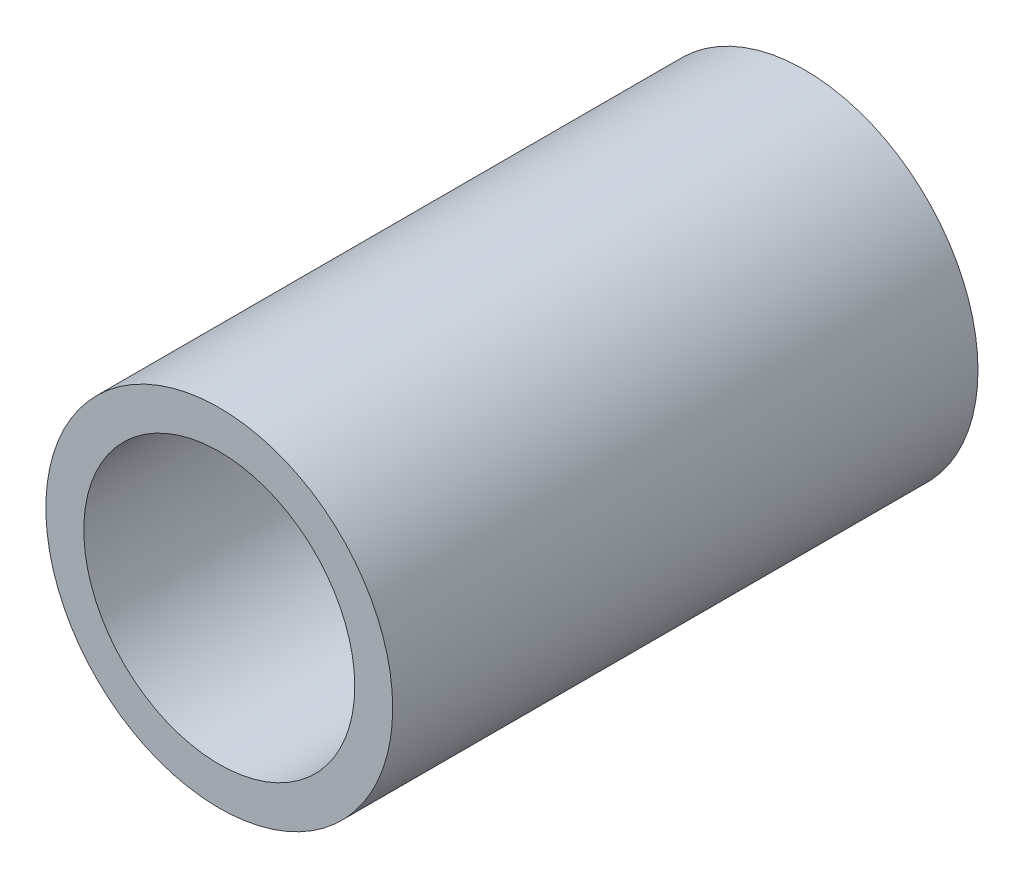
ISO-10303-21;
HEADER;
FILE_DESCRIPTION(('STEP AP214'),'2;1');
FILE_NAME('part.step','',(''),(''),'','','');
FILE_SCHEMA(('AUTOMOTIVE_DESIGN { 1 0 10303 214 1 1 1 1 }'));
ENDSEC;
DATA;
#1=APPLICATION_CONTEXT('core data for automotive mechanical design processes');
#2=APPLICATION_PROTOCOL_DEFINITION('international standard','automotive_design',2000,#1);
#3=PRODUCT_CONTEXT('',#1,'mechanical');
#4=PRODUCT('Part','Part','',(#3));
#5=PRODUCT_RELATED_PRODUCT_CATEGORY('part','',(#4));
#6=PRODUCT_DEFINITION_FORMATION('','',#4);
#7=PRODUCT_DEFINITION_CONTEXT('part definition',#1,'design');
#8=PRODUCT_DEFINITION('design','',#6,#7);
#9=PRODUCT_DEFINITION_SHAPE('','',#8);
#10=(LENGTH_UNIT() NAMED_UNIT(*) SI_UNIT(.MILLI.,.METRE.));
#11=(NAMED_UNIT(*) PLANE_ANGLE_UNIT() SI_UNIT($,.RADIAN.));
#12=(NAMED_UNIT(*) SI_UNIT($,.STERADIAN.) SOLID_ANGLE_UNIT());
#13=UNCERTAINTY_MEASURE_WITH_UNIT(LENGTH_MEASURE(1.E-05),#10,'distance_accuracy_value','');
#14=(GEOMETRIC_REPRESENTATION_CONTEXT(3) GLOBAL_UNCERTAINTY_ASSIGNED_CONTEXT((#13)) GLOBAL_UNIT_ASSIGNED_CONTEXT((#10,
#11,#12)) REPRESENTATION_CONTEXT('',''));
#15=CARTESIAN_POINT('',(0.,0.,0.));
#16=DIRECTION('',(0.,0.,1.));
#17=DIRECTION('',(1.,0.,0.));
#18=AXIS2_PLACEMENT_3D('',#15,#16,#17);
#19=CARTESIAN_POINT('',(0.,0.,54.));
#20=DIRECTION('',(0.,0.,-1.));
#21=DIRECTION('',(-1.,0.,0.));
#22=AXIS2_PLACEMENT_3D('',#19,#20,#21);
#23=CYLINDRICAL_SURFACE('',#22,16.);
#24=CARTESIAN_POINT('',(0.,0.,54.));
#25=DIRECTION('',(0.,0.,1.));
#26=DIRECTION('',(1.,0.,0.));
#27=AXIS2_PLACEMENT_3D('',#24,#25,#26);
#28=CIRCLE('',#27,16.);
#29=CARTESIAN_POINT('',(16.,0.,54.));
#30=VERTEX_POINT('',#29);
#31=EDGE_CURVE('E10',#30,#30,#28,.T.);
#32=ORIENTED_EDGE('',*,*,#31,.F.);
#33=EDGE_LOOP('',(#32));
#34=FACE_BOUND('',#33,.T.);
#35=CARTESIAN_POINT('',(0.,0.,0.));
#36=DIRECTION('',(0.,0.,1.));
#37=DIRECTION('',(1.,0.,0.));
#38=AXIS2_PLACEMENT_3D('',#35,#36,#37);
#39=CIRCLE('',#38,16.);
#40=CARTESIAN_POINT('',(16.,0.,0.));
#41=VERTEX_POINT('',#40);
#42=EDGE_CURVE('E37',#41,#41,#39,.T.);
#43=ORIENTED_EDGE('',*,*,#42,.T.);
#44=EDGE_LOOP('',(#43));
#45=FACE_BOUND('',#44,.T.);
#46=ADVANCED_FACE('F34',(#34,#45),#23,.T.);
#47=CARTESIAN_POINT('',(0.,0.,54.));
#48=DIRECTION('',(0.,0.,1.));
#49=DIRECTION('',(1.,0.,0.));
#50=AXIS2_PLACEMENT_3D('',#47,#48,#49);
#51=PLANE('',#50);
#52=CARTESIAN_POINT('',(0.,0.,54.));
#53=DIRECTION('',(0.,0.,1.));
#54=DIRECTION('',(1.,0.,0.));
#55=AXIS2_PLACEMENT_3D('',#52,#53,#54);
#56=CIRCLE('',#55,12.5);
#57=CARTESIAN_POINT('',(12.5,0.,54.));
#58=VERTEX_POINT('',#57);
#59=EDGE_CURVE('E46',#58,#58,#56,.T.);
#60=ORIENTED_EDGE('',*,*,#59,.F.);
#61=EDGE_LOOP('',(#60));
#62=FACE_BOUND('',#61,.T.);
#63=ORIENTED_EDGE('',*,*,#31,.T.);
#64=EDGE_LOOP('',(#63));
#65=FACE_BOUND('',#64,.T.);
#66=ADVANCED_FACE('F61',(#62,#65),#51,.T.);
#67=CARTESIAN_POINT('',(0.,0.,0.));
#68=DIRECTION('',(0.,0.,1.));
#69=DIRECTION('',(1.,0.,0.));
#70=AXIS2_PLACEMENT_3D('',#67,#68,#69);
#71=PLANE('',#70);
#72=CARTESIAN_POINT('',(0.,0.,0.));
#73=DIRECTION('',(0.,0.,1.));
#74=DIRECTION('',(1.,0.,0.));
#75=AXIS2_PLACEMENT_3D('',#72,#73,#74);
#76=CIRCLE('',#75,12.5);
#77=CARTESIAN_POINT('',(12.5,0.,0.));
#78=VERTEX_POINT('',#77);
#79=EDGE_CURVE('E44',#78,#78,#76,.T.);
#80=ORIENTED_EDGE('',*,*,#79,.T.);
#81=EDGE_LOOP('',(#80));
#82=FACE_BOUND('',#81,.T.);
#83=ORIENTED_EDGE('',*,*,#42,.F.);
#84=EDGE_LOOP('',(#83));
#85=FACE_BOUND('',#84,.T.);
#86=ADVANCED_FACE('F52',(#82,#85),#71,.F.);
#87=CARTESIAN_POINT('',(0.,0.,0.));
#88=DIRECTION('',(0.,0.,1.));
#89=DIRECTION('',(1.,0.,0.));
#90=AXIS2_PLACEMENT_3D('',#87,#88,#89);
#91=CYLINDRICAL_SURFACE('',#90,12.5);
#92=ORIENTED_EDGE('',*,*,#79,.F.);
#93=EDGE_LOOP('',(#92));
#94=FACE_BOUND('',#93,.T.);
#95=ORIENTED_EDGE('',*,*,#59,.T.);
#96=EDGE_LOOP('',(#95));
#97=FACE_BOUND('',#96,.T.);
#98=ADVANCED_FACE('F55',(#94,#97),#91,.F.);
#99=CLOSED_SHELL('',(#46,#66,#86,#98));
#100=MANIFOLD_SOLID_BREP('B2',#99);
#101=ADVANCED_BREP_SHAPE_REPRESENTATION('',(#18,#100),#14);
#102=SHAPE_DEFINITION_REPRESENTATION(#9,#101);
ENDSEC;
END-ISO-10303-21;
